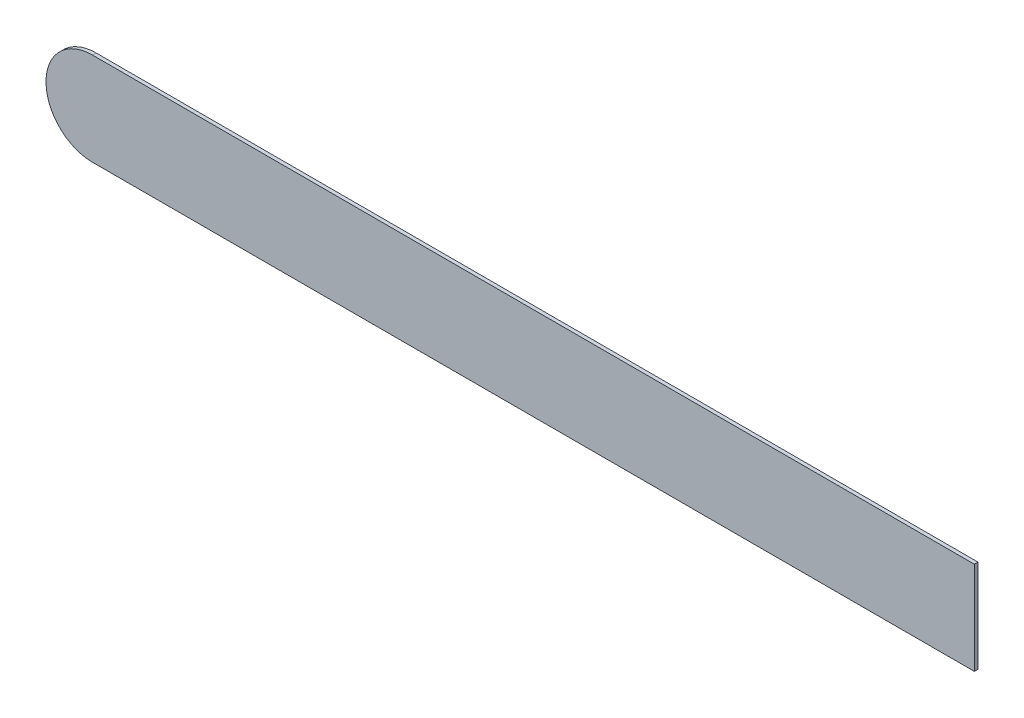
ISO-10303-21;
HEADER;
FILE_DESCRIPTION(('STEP AP214'),'2;1');
FILE_NAME('part.step','',(''),(''),'','','');
FILE_SCHEMA(('AUTOMOTIVE_DESIGN { 1 0 10303 214 1 1 1 1 }'));
ENDSEC;
DATA;
#1=APPLICATION_CONTEXT('core data for automotive mechanical design processes');
#2=APPLICATION_PROTOCOL_DEFINITION('international standard','automotive_design',2000,#1);
#3=PRODUCT_CONTEXT('',#1,'mechanical');
#4=PRODUCT('Part','Part','',(#3));
#5=PRODUCT_RELATED_PRODUCT_CATEGORY('part','',(#4));
#6=PRODUCT_DEFINITION_FORMATION('','',#4);
#7=PRODUCT_DEFINITION_CONTEXT('part definition',#1,'design');
#8=PRODUCT_DEFINITION('design','',#6,#7);
#9=PRODUCT_DEFINITION_SHAPE('','',#8);
#10=(LENGTH_UNIT() NAMED_UNIT(*) SI_UNIT(.MILLI.,.METRE.));
#11=(NAMED_UNIT(*) PLANE_ANGLE_UNIT() SI_UNIT($,.RADIAN.));
#12=(NAMED_UNIT(*) SI_UNIT($,.STERADIAN.) SOLID_ANGLE_UNIT());
#13=UNCERTAINTY_MEASURE_WITH_UNIT(LENGTH_MEASURE(1.E-05),#10,'distance_accuracy_value','');
#14=(GEOMETRIC_REPRESENTATION_CONTEXT(3) GLOBAL_UNCERTAINTY_ASSIGNED_CONTEXT((#13)) GLOBAL_UNIT_ASSIGNED_CONTEXT((#10,
#11,#12)) REPRESENTATION_CONTEXT('',''));
#15=CARTESIAN_POINT('',(0.,0.,0.));
#16=DIRECTION('',(0.,0.,1.));
#17=DIRECTION('',(1.,0.,0.));
#18=AXIS2_PLACEMENT_3D('',#15,#16,#17);
#19=CARTESIAN_POINT('',(-63.5000000000003,6.34999999999997,0.249999999999972));
#20=DIRECTION('',(0.,0.,-1.));
#21=DIRECTION('',(-1.,0.,0.));
#22=AXIS2_PLACEMENT_3D('',#19,#20,#21);
#23=PLANE('',#22);
#24=DIRECTION('',(1.,0.,0.));
#25=VECTOR('',#24,1.);
#26=CARTESIAN_POINT('',(-63.5000000000003,6.34999999999997,0.249999999999972));
#27=LINE('',#26,#25);
#28=CARTESIAN_POINT('',(-57.15,6.34999999999997,0.249999999999972));
#29=VERTEX_POINT('',#28);
#30=CARTESIAN_POINT('',(63.5000000000003,6.34999999999997,0.249999999999972));
#31=VERTEX_POINT('',#30);
#32=EDGE_CURVE('E88',#29,#31,#27,.T.);
#33=ORIENTED_EDGE('',*,*,#32,.F.);
#34=CARTESIAN_POINT('',(-57.15,0.,0.249999999999972));
#35=DIRECTION('',(0.,0.,-1.));
#36=DIRECTION('',(-1.,0.,0.));
#37=AXIS2_PLACEMENT_3D('',#34,#35,#36);
#38=CIRCLE('',#37,6.35);
#39=CARTESIAN_POINT('',(-63.5000000000003,0.,0.249999999999972));
#40=VERTEX_POINT('',#39);
#41=EDGE_CURVE('E143',#29,#40,#38,.F.);
#42=ORIENTED_EDGE('',*,*,#41,.T.);
#43=CARTESIAN_POINT('',(-57.15,0.,0.249999999999972));
#44=DIRECTION('',(0.,0.,-1.));
#45=DIRECTION('',(-1.,0.,0.));
#46=AXIS2_PLACEMENT_3D('',#43,#44,#45);
#47=CIRCLE('',#46,6.35);
#48=CARTESIAN_POINT('',(-57.15,-6.34999999999997,0.249999999999972));
#49=VERTEX_POINT('',#48);
#50=EDGE_CURVE('E129',#40,#49,#47,.F.);
#51=ORIENTED_EDGE('',*,*,#50,.T.);
#52=DIRECTION('',(1.,0.,0.));
#53=VECTOR('',#52,1.);
#54=CARTESIAN_POINT('',(-63.5000000000003,-6.34999999999997,0.249999999999972));
#55=LINE('',#54,#53);
#56=CARTESIAN_POINT('',(63.5000000000003,-6.34999999999997,0.249999999999972));
#57=VERTEX_POINT('',#56);
#58=EDGE_CURVE('E102',#49,#57,#55,.T.);
#59=ORIENTED_EDGE('',*,*,#58,.T.);
#60=DIRECTION('',(0.,-1.,0.));
#61=VECTOR('',#60,1.);
#62=CARTESIAN_POINT('',(63.5000000000003,6.34999999999997,0.249999999999972));
#63=LINE('',#62,#61);
#64=EDGE_CURVE('E101',#31,#57,#63,.T.);
#65=ORIENTED_EDGE('',*,*,#64,.F.);
#66=EDGE_LOOP('',(#33,#42,#51,#59,#65));
#67=FACE_BOUND('',#66,.T.);
#68=ADVANCED_FACE('F39',(#67),#23,.F.);
#69=CARTESIAN_POINT('',(63.5000000000003,6.34999999999997,0.249999999999972));
#70=DIRECTION('',(-1.,0.,0.));
#71=DIRECTION('',(0.,0.,1.));
#72=AXIS2_PLACEMENT_3D('',#69,#70,#71);
#73=PLANE('',#72);
#74=DIRECTION('',(0.,0.,-1.));
#75=VECTOR('',#74,1.);
#76=CARTESIAN_POINT('',(63.5000000000003,-6.34999999999997,0.249999999999972));
#77=LINE('',#76,#75);
#78=CARTESIAN_POINT('',(63.5000000000003,-6.34999999999997,-0.250000000000028));
#79=VERTEX_POINT('',#78);
#80=EDGE_CURVE('E135',#57,#79,#77,.T.);
#81=ORIENTED_EDGE('',*,*,#80,.T.);
#82=DIRECTION('',(0.,-1.,0.));
#83=VECTOR('',#82,1.);
#84=CARTESIAN_POINT('',(63.5000000000003,6.34999999999997,-0.250000000000028));
#85=LINE('',#84,#83);
#86=CARTESIAN_POINT('',(63.5000000000003,6.34999999999997,-0.250000000000028));
#87=VERTEX_POINT('',#86);
#88=EDGE_CURVE('E105',#87,#79,#85,.T.);
#89=ORIENTED_EDGE('',*,*,#88,.F.);
#90=DIRECTION('',(0.,0.,-1.));
#91=VECTOR('',#90,1.);
#92=CARTESIAN_POINT('',(63.5000000000003,6.34999999999997,0.249999999999972));
#93=LINE('',#92,#91);
#94=EDGE_CURVE('E93',#31,#87,#93,.T.);
#95=ORIENTED_EDGE('',*,*,#94,.F.);
#96=ORIENTED_EDGE('',*,*,#64,.T.);
#97=EDGE_LOOP('',(#81,#89,#95,#96));
#98=FACE_BOUND('',#97,.T.);
#99=ADVANCED_FACE('F107',(#98),#73,.F.);
#100=CARTESIAN_POINT('',(-63.5000000000003,6.34999999999997,-0.250000000000028));
#101=DIRECTION('',(0.,0.,1.));
#102=DIRECTION('',(1.,0.,0.));
#103=AXIS2_PLACEMENT_3D('',#100,#101,#102);
#104=PLANE('',#103);
#105=CARTESIAN_POINT('',(-57.15,0.,-0.250000000000028));
#106=DIRECTION('',(0.,0.,1.));
#107=DIRECTION('',(1.,0.,0.));
#108=AXIS2_PLACEMENT_3D('',#105,#106,#107);
#109=CIRCLE('',#108,6.35);
#110=CARTESIAN_POINT('',(-57.15,-6.34999999999997,-0.250000000000028));
#111=VERTEX_POINT('',#110);
#112=CARTESIAN_POINT('',(-63.5000000000003,0.,-0.250000000000028));
#113=VERTEX_POINT('',#112);
#114=EDGE_CURVE('E56',#111,#113,#109,.F.);
#115=ORIENTED_EDGE('',*,*,#114,.T.);
#116=CARTESIAN_POINT('',(-57.15,0.,-0.250000000000028));
#117=DIRECTION('',(0.,0.,1.));
#118=DIRECTION('',(1.,0.,0.));
#119=AXIS2_PLACEMENT_3D('',#116,#117,#118);
#120=CIRCLE('',#119,6.35);
#121=CARTESIAN_POINT('',(-57.15,6.34999999999997,-0.250000000000028));
#122=VERTEX_POINT('',#121);
#123=EDGE_CURVE('E49',#113,#122,#120,.F.);
#124=ORIENTED_EDGE('',*,*,#123,.T.);
#125=DIRECTION('',(-1.,0.,0.));
#126=VECTOR('',#125,1.);
#127=CARTESIAN_POINT('',(-63.5000000000003,6.34999999999997,-0.250000000000028));
#128=LINE('',#127,#126);
#129=EDGE_CURVE('E110',#87,#122,#128,.T.);
#130=ORIENTED_EDGE('',*,*,#129,.F.);
#131=ORIENTED_EDGE('',*,*,#88,.T.);
#132=DIRECTION('',(-1.,0.,0.));
#133=VECTOR('',#132,1.);
#134=CARTESIAN_POINT('',(-63.5000000000003,-6.34999999999997,-0.250000000000028));
#135=LINE('',#134,#133);
#136=EDGE_CURVE('E98',#79,#111,#135,.T.);
#137=ORIENTED_EDGE('',*,*,#136,.T.);
#138=EDGE_LOOP('',(#115,#124,#130,#131,#137));
#139=FACE_BOUND('',#138,.T.);
#140=ADVANCED_FACE('F138',(#139),#104,.F.);
#141=CARTESIAN_POINT('',(-63.5000000000003,6.34999999999997,-0.250000000000028));
#142=DIRECTION('',(0.,-1.,0.));
#143=DIRECTION('',(0.,0.,-1.));
#144=AXIS2_PLACEMENT_3D('',#141,#142,#143);
#145=PLANE('',#144);
#146=ORIENTED_EDGE('',*,*,#129,.T.);
#147=DIRECTION('',(0.,0.,1.));
#148=VECTOR('',#147,1.);
#149=CARTESIAN_POINT('',(-57.15,6.34999999999997,-0.250000000000028));
#150=LINE('',#149,#148);
#151=EDGE_CURVE('E96',#122,#29,#150,.T.);
#152=ORIENTED_EDGE('',*,*,#151,.T.);
#153=ORIENTED_EDGE('',*,*,#32,.T.);
#154=ORIENTED_EDGE('',*,*,#94,.T.);
#155=EDGE_LOOP('',(#146,#152,#153,#154));
#156=FACE_BOUND('',#155,.T.);
#157=ADVANCED_FACE('F91',(#156),#145,.F.);
#158=CARTESIAN_POINT('',(-63.5000000000003,-6.34999999999997,-0.250000000000028));
#159=DIRECTION('',(0.,-1.,0.));
#160=DIRECTION('',(0.,0.,-1.));
#161=AXIS2_PLACEMENT_3D('',#158,#159,#160);
#162=PLANE('',#161);
#163=ORIENTED_EDGE('',*,*,#58,.F.);
#164=DIRECTION('',(0.,0.,1.));
#165=VECTOR('',#164,1.);
#166=CARTESIAN_POINT('',(-57.15,-6.34999999999997,-0.250000000000028));
#167=LINE('',#166,#165);
#168=EDGE_CURVE('E12',#49,#111,#167,.F.);
#169=ORIENTED_EDGE('',*,*,#168,.T.);
#170=ORIENTED_EDGE('',*,*,#136,.F.);
#171=ORIENTED_EDGE('',*,*,#80,.F.);
#172=EDGE_LOOP('',(#163,#169,#170,#171));
#173=FACE_BOUND('',#172,.T.);
#174=ADVANCED_FACE('F146',(#173),#162,.T.);
#175=CARTESIAN_POINT('',(-57.15,0.,0.249999999999972));
#176=DIRECTION('',(0.,0.,-1.));
#177=DIRECTION('',(-1.,0.,0.));
#178=AXIS2_PLACEMENT_3D('',#175,#176,#177);
#179=CYLINDRICAL_SURFACE('',#178,6.35);
#180=DIRECTION('',(0.,0.,1.));
#181=VECTOR('',#180,1.);
#182=CARTESIAN_POINT('',(-63.5000000000003,0.,0.249999999999972));
#183=LINE('',#182,#181);
#184=EDGE_CURVE('E43',#113,#40,#183,.T.);
#185=ORIENTED_EDGE('',*,*,#184,.F.);
#186=ORIENTED_EDGE('',*,*,#114,.F.);
#187=ORIENTED_EDGE('',*,*,#168,.F.);
#188=ORIENTED_EDGE('',*,*,#50,.F.);
#189=EDGE_LOOP('',(#185,#186,#187,#188));
#190=FACE_BOUND('',#189,.T.);
#191=ADVANCED_FACE('F41',(#190),#179,.T.);
#192=CARTESIAN_POINT('',(-57.15,0.,-0.250000000000028));
#193=DIRECTION('',(0.,0.,1.));
#194=DIRECTION('',(1.,0.,0.));
#195=AXIS2_PLACEMENT_3D('',#192,#193,#194);
#196=CYLINDRICAL_SURFACE('',#195,6.35);
#197=ORIENTED_EDGE('',*,*,#123,.F.);
#198=ORIENTED_EDGE('',*,*,#184,.T.);
#199=ORIENTED_EDGE('',*,*,#41,.F.);
#200=ORIENTED_EDGE('',*,*,#151,.F.);
#201=EDGE_LOOP('',(#197,#198,#199,#200));
#202=FACE_BOUND('',#201,.T.);
#203=ADVANCED_FACE('F153',(#202),#196,.T.);
#204=CLOSED_SHELL('',(#68,#99,#140,#157,#174,#191,#203));
#205=MANIFOLD_SOLID_BREP('B2',#204);
#206=ADVANCED_BREP_SHAPE_REPRESENTATION('',(#18,#205),#14);
#207=SHAPE_DEFINITION_REPRESENTATION(#9,#206);
ENDSEC;
END-ISO-10303-21;
